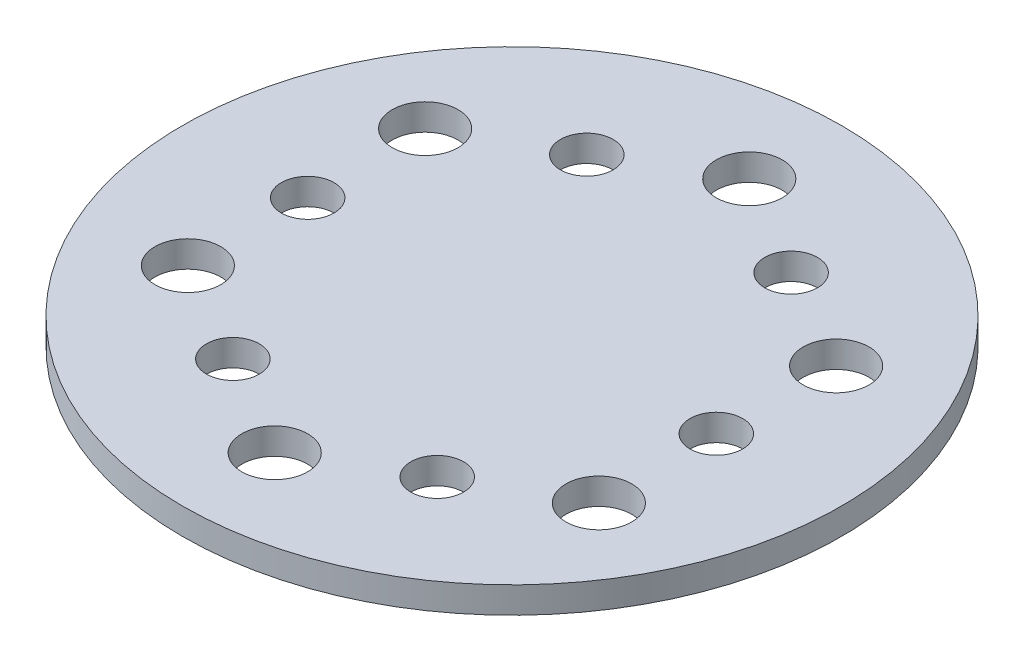
ISO-10303-21;
HEADER;
FILE_DESCRIPTION(('STEP AP214'),'2;1');
FILE_NAME('part.step','',(''),(''),'','','');
FILE_SCHEMA(('AUTOMOTIVE_DESIGN { 1 0 10303 214 1 1 1 1 }'));
ENDSEC;
DATA;
#1=APPLICATION_CONTEXT('core data for automotive mechanical design processes');
#2=APPLICATION_PROTOCOL_DEFINITION('international standard','automotive_design',2000,#1);
#3=PRODUCT_CONTEXT('',#1,'mechanical');
#4=PRODUCT('Part','Part','',(#3));
#5=PRODUCT_RELATED_PRODUCT_CATEGORY('part','',(#4));
#6=PRODUCT_DEFINITION_FORMATION('','',#4);
#7=PRODUCT_DEFINITION_CONTEXT('part definition',#1,'design');
#8=PRODUCT_DEFINITION('design','',#6,#7);
#9=PRODUCT_DEFINITION_SHAPE('','',#8);
#10=(LENGTH_UNIT() NAMED_UNIT(*) SI_UNIT(.MILLI.,.METRE.));
#11=(NAMED_UNIT(*) PLANE_ANGLE_UNIT() SI_UNIT($,.RADIAN.));
#12=(NAMED_UNIT(*) SI_UNIT($,.STERADIAN.) SOLID_ANGLE_UNIT());
#13=UNCERTAINTY_MEASURE_WITH_UNIT(LENGTH_MEASURE(1.E-05),#10,'distance_accuracy_value','');
#14=(GEOMETRIC_REPRESENTATION_CONTEXT(3) GLOBAL_UNCERTAINTY_ASSIGNED_CONTEXT((#13)) GLOBAL_UNIT_ASSIGNED_CONTEXT((#10,
#11,#12)) REPRESENTATION_CONTEXT('',''));
#15=CARTESIAN_POINT('',(0.,0.,0.));
#16=DIRECTION('',(0.,0.,1.));
#17=DIRECTION('',(1.,0.,0.));
#18=AXIS2_PLACEMENT_3D('',#15,#16,#17);
#19=CARTESIAN_POINT('',(0.,2.,0.));
#20=DIRECTION('',(0.,-1.,0.));
#21=DIRECTION('',(0.,0.,-1.));
#22=AXIS2_PLACEMENT_3D('',#19,#20,#21);
#23=CYLINDRICAL_SURFACE('',#22,25.);
#24=CARTESIAN_POINT('',(0.,2.,0.));
#25=DIRECTION('',(0.,1.,0.));
#26=DIRECTION('',(0.,0.,1.));
#27=AXIS2_PLACEMENT_3D('',#24,#25,#26);
#28=CIRCLE('',#27,25.);
#29=CARTESIAN_POINT('',(0.,2.,25.));
#30=VERTEX_POINT('',#29);
#31=EDGE_CURVE('E10',#30,#30,#28,.T.);
#32=ORIENTED_EDGE('',*,*,#31,.F.);
#33=EDGE_LOOP('',(#32));
#34=FACE_BOUND('',#33,.T.);
#35=CARTESIAN_POINT('',(0.,0.,0.));
#36=DIRECTION('',(0.,1.,0.));
#37=DIRECTION('',(0.,0.,1.));
#38=AXIS2_PLACEMENT_3D('',#35,#36,#37);
#39=CIRCLE('',#38,25.);
#40=CARTESIAN_POINT('',(0.,0.,25.));
#41=VERTEX_POINT('',#40);
#42=EDGE_CURVE('E40',#41,#41,#39,.T.);
#43=ORIENTED_EDGE('',*,*,#42,.T.);
#44=EDGE_LOOP('',(#43));
#45=FACE_BOUND('',#44,.T.);
#46=ADVANCED_FACE('F37',(#34,#45),#23,.T.);
#47=CARTESIAN_POINT('',(0.,2.,0.));
#48=DIRECTION('',(0.,1.,0.));
#49=DIRECTION('',(0.,0.,1.));
#50=AXIS2_PLACEMENT_3D('',#47,#48,#49);
#51=PLANE('',#50);
#52=CARTESIAN_POINT('',(-1.25693328198353E-13,2.,18.));
#53=DIRECTION('',(0.,1.,0.));
#54=DIRECTION('',(0.,0.,1.));
#55=AXIS2_PLACEMENT_3D('',#52,#53,#54);
#56=CIRCLE('',#55,2.5);
#57=CARTESIAN_POINT('',(-1.25693328198353E-13,2.,20.5));
#58=VERTEX_POINT('',#57);
#59=EDGE_CURVE('E64',#58,#58,#56,.T.);
#60=ORIENTED_EDGE('',*,*,#59,.F.);
#61=EDGE_LOOP('',(#60));
#62=FACE_BOUND('',#61,.T.);
#63=CARTESIAN_POINT('',(-7.74999999999997,2.,-13.4233937586588));
#64=DIRECTION('',(0.,1.,0.));
#65=DIRECTION('',(0.,0.,1.));
#66=AXIS2_PLACEMENT_3D('',#63,#64,#65);
#67=CIRCLE('',#66,2.);
#68=CARTESIAN_POINT('',(-7.74999999999997,2.,-11.4233937586588));
#69=VERTEX_POINT('',#68);
#70=EDGE_CURVE('E95',#69,#69,#67,.T.);
#71=ORIENTED_EDGE('',*,*,#70,.F.);
#72=EDGE_LOOP('',(#71));
#73=FACE_BOUND('',#72,.T.);
#74=CARTESIAN_POINT('',(-15.5884572681198,2.,-9.00000000000018));
#75=DIRECTION('',(0.,1.,0.));
#76=DIRECTION('',(0.,0.,1.));
#77=AXIS2_PLACEMENT_3D('',#74,#75,#76);
#78=CIRCLE('',#77,2.5);
#79=CARTESIAN_POINT('',(-15.5884572681198,2.,-6.50000000000018));
#80=VERTEX_POINT('',#79);
#81=EDGE_CURVE('E96',#80,#80,#78,.T.);
#82=ORIENTED_EDGE('',*,*,#81,.F.);
#83=EDGE_LOOP('',(#82));
#84=FACE_BOUND('',#83,.T.);
#85=CARTESIAN_POINT('',(-7.75000000000016,2.,13.4233937586587));
#86=DIRECTION('',(0.,1.,0.));
#87=DIRECTION('',(0.,0.,1.));
#88=AXIS2_PLACEMENT_3D('',#85,#86,#87);
#89=CIRCLE('',#88,2.);
#90=CARTESIAN_POINT('',(-7.75000000000016,2.,15.4233937586587));
#91=VERTEX_POINT('',#90);
#92=EDGE_CURVE('E111',#91,#91,#89,.T.);
#93=ORIENTED_EDGE('',*,*,#92,.F.);
#94=EDGE_LOOP('',(#93));
#95=FACE_BOUND('',#94,.T.);
#96=CARTESIAN_POINT('',(-15.5884572681199,2.,9.00000000000001));
#97=DIRECTION('',(0.,1.,0.));
#98=DIRECTION('',(0.,0.,1.));
#99=AXIS2_PLACEMENT_3D('',#96,#97,#98);
#100=CIRCLE('',#99,2.50000000000017);
#101=CARTESIAN_POINT('',(-15.5884572681199,2.,11.5000000000002));
#102=VERTEX_POINT('',#101);
#103=EDGE_CURVE('E63',#102,#102,#100,.T.);
#104=ORIENTED_EDGE('',*,*,#103,.F.);
#105=EDGE_LOOP('',(#104));
#106=FACE_BOUND('',#105,.T.);
#107=CARTESIAN_POINT('',(0.,2.,-18.));
#108=DIRECTION('',(0.,1.,0.));
#109=DIRECTION('',(0.,0.,1.));
#110=AXIS2_PLACEMENT_3D('',#107,#108,#109);
#111=CIRCLE('',#110,2.5);
#112=CARTESIAN_POINT('',(0.,2.,-15.5));
#113=VERTEX_POINT('',#112);
#114=EDGE_CURVE('E72',#113,#113,#111,.T.);
#115=ORIENTED_EDGE('',*,*,#114,.F.);
#116=EDGE_LOOP('',(#115));
#117=FACE_BOUND('',#116,.T.);
#118=CARTESIAN_POINT('',(15.5884572681199,2.,-8.99999999999996));
#119=DIRECTION('',(0.,1.,0.));
#120=DIRECTION('',(0.,0.,1.));
#121=AXIS2_PLACEMENT_3D('',#118,#119,#120);
#122=CIRCLE('',#121,2.5);
#123=CARTESIAN_POINT('',(15.5884572681199,2.,-6.49999999999996));
#124=VERTEX_POINT('',#123);
#125=EDGE_CURVE('E80',#124,#124,#122,.T.);
#126=ORIENTED_EDGE('',*,*,#125,.F.);
#127=EDGE_LOOP('',(#126));
#128=FACE_BOUND('',#127,.T.);
#129=CARTESIAN_POINT('',(15.5884572681199,2.,9.00000000000007));
#130=DIRECTION('',(0.,1.,0.));
#131=DIRECTION('',(0.,0.,1.));
#132=AXIS2_PLACEMENT_3D('',#129,#130,#131);
#133=CIRCLE('',#132,2.5);
#134=CARTESIAN_POINT('',(15.5884572681199,2.,11.5000000000001));
#135=VERTEX_POINT('',#134);
#136=EDGE_CURVE('E55',#135,#135,#133,.T.);
#137=ORIENTED_EDGE('',*,*,#136,.F.);
#138=EDGE_LOOP('',(#137));
#139=FACE_BOUND('',#138,.T.);
#140=CARTESIAN_POINT('',(7.74999999999987,2.,13.4233937586589));
#141=DIRECTION('',(0.,1.,0.));
#142=DIRECTION('',(0.,0.,1.));
#143=AXIS2_PLACEMENT_3D('',#140,#141,#142);
#144=CIRCLE('',#143,2.);
#145=CARTESIAN_POINT('',(7.74999999999987,2.,15.4233937586589));
#146=VERTEX_POINT('',#145);
#147=EDGE_CURVE('E112',#146,#146,#144,.T.);
#148=ORIENTED_EDGE('',*,*,#147,.F.);
#149=EDGE_LOOP('',(#148));
#150=FACE_BOUND('',#149,.T.);
#151=CARTESIAN_POINT('',(15.5,2.,1.08235921504137E-13));
#152=DIRECTION('',(0.,1.,0.));
#153=DIRECTION('',(0.,0.,1.));
#154=AXIS2_PLACEMENT_3D('',#151,#152,#153);
#155=CIRCLE('',#154,2.);
#156=CARTESIAN_POINT('',(15.5,2.,2.00000000000011));
#157=VERTEX_POINT('',#156);
#158=EDGE_CURVE('E135',#157,#157,#155,.T.);
#159=ORIENTED_EDGE('',*,*,#158,.F.);
#160=EDGE_LOOP('',(#159));
#161=FACE_BOUND('',#160,.T.);
#162=CARTESIAN_POINT('',(7.75000000000006,2.,-13.4233937586588));
#163=DIRECTION('',(0.,1.,0.));
#164=DIRECTION('',(0.,0.,1.));
#165=AXIS2_PLACEMENT_3D('',#162,#163,#164);
#166=CIRCLE('',#165,2.);
#167=CARTESIAN_POINT('',(7.75000000000006,2.,-11.4233937586588));
#168=VERTEX_POINT('',#167);
#169=EDGE_CURVE('E127',#168,#168,#166,.T.);
#170=ORIENTED_EDGE('',*,*,#169,.F.);
#171=EDGE_LOOP('',(#170));
#172=FACE_BOUND('',#171,.T.);
#173=CARTESIAN_POINT('',(-15.5,2.,0.));
#174=DIRECTION('',(0.,1.,0.));
#175=DIRECTION('',(0.,0.,1.));
#176=AXIS2_PLACEMENT_3D('',#173,#174,#175);
#177=CIRCLE('',#176,2.);
#178=CARTESIAN_POINT('',(-15.5,2.,2.));
#179=VERTEX_POINT('',#178);
#180=EDGE_CURVE('E51',#179,#179,#177,.T.);
#181=ORIENTED_EDGE('',*,*,#180,.F.);
#182=EDGE_LOOP('',(#181));
#183=FACE_BOUND('',#182,.T.);
#184=ORIENTED_EDGE('',*,*,#31,.T.);
#185=EDGE_LOOP('',(#184));
#186=FACE_BOUND('',#185,.T.);
#187=ADVANCED_FACE('F149',(#62,#73,#84,#95,#106,#117,#128,#139,#150,#161,#172,#183,#186),#51,.T.);
#188=CARTESIAN_POINT('',(0.,0.,0.));
#189=DIRECTION('',(0.,1.,0.));
#190=DIRECTION('',(0.,0.,1.));
#191=AXIS2_PLACEMENT_3D('',#188,#189,#190);
#192=PLANE('',#191);
#193=CARTESIAN_POINT('',(-1.25693328198353E-13,0.,18.));
#194=DIRECTION('',(0.,1.,0.));
#195=DIRECTION('',(0.,0.,1.));
#196=AXIS2_PLACEMENT_3D('',#193,#194,#195);
#197=CIRCLE('',#196,2.5);
#198=CARTESIAN_POINT('',(-1.25693328198353E-13,0.,20.5));
#199=VERTEX_POINT('',#198);
#200=EDGE_CURVE('E100',#199,#199,#197,.T.);
#201=ORIENTED_EDGE('',*,*,#200,.T.);
#202=EDGE_LOOP('',(#201));
#203=FACE_BOUND('',#202,.T.);
#204=CARTESIAN_POINT('',(-7.74999999999997,0.,-13.4233937586588));
#205=DIRECTION('',(0.,1.,0.));
#206=DIRECTION('',(0.,0.,1.));
#207=AXIS2_PLACEMENT_3D('',#204,#205,#206);
#208=CIRCLE('',#207,2.);
#209=CARTESIAN_POINT('',(-7.74999999999997,0.,-11.4233937586588));
#210=VERTEX_POINT('',#209);
#211=EDGE_CURVE('E91',#210,#210,#208,.T.);
#212=ORIENTED_EDGE('',*,*,#211,.T.);
#213=EDGE_LOOP('',(#212));
#214=FACE_BOUND('',#213,.T.);
#215=CARTESIAN_POINT('',(-15.5884572681198,0.,-9.00000000000018));
#216=DIRECTION('',(0.,1.,0.));
#217=DIRECTION('',(0.,0.,1.));
#218=AXIS2_PLACEMENT_3D('',#215,#216,#217);
#219=CIRCLE('',#218,2.5);
#220=CARTESIAN_POINT('',(-15.5884572681198,0.,-6.50000000000018));
#221=VERTEX_POINT('',#220);
#222=EDGE_CURVE('E116',#221,#221,#219,.T.);
#223=ORIENTED_EDGE('',*,*,#222,.T.);
#224=EDGE_LOOP('',(#223));
#225=FACE_BOUND('',#224,.T.);
#226=CARTESIAN_POINT('',(-7.75000000000016,0.,13.4233937586587));
#227=DIRECTION('',(0.,1.,0.));
#228=DIRECTION('',(0.,0.,1.));
#229=AXIS2_PLACEMENT_3D('',#226,#227,#228);
#230=CIRCLE('',#229,2.);
#231=CARTESIAN_POINT('',(-7.75000000000016,0.,15.4233937586587));
#232=VERTEX_POINT('',#231);
#233=EDGE_CURVE('E107',#232,#232,#230,.T.);
#234=ORIENTED_EDGE('',*,*,#233,.T.);
#235=EDGE_LOOP('',(#234));
#236=FACE_BOUND('',#235,.T.);
#237=CARTESIAN_POINT('',(-15.5884572681199,0.,9.00000000000001));
#238=DIRECTION('',(0.,1.,0.));
#239=DIRECTION('',(0.,0.,1.));
#240=AXIS2_PLACEMENT_3D('',#237,#238,#239);
#241=CIRCLE('',#240,2.50000000000017);
#242=CARTESIAN_POINT('',(-15.5884572681199,0.,11.5000000000002));
#243=VERTEX_POINT('',#242);
#244=EDGE_CURVE('E59',#243,#243,#241,.T.);
#245=ORIENTED_EDGE('',*,*,#244,.T.);
#246=EDGE_LOOP('',(#245));
#247=FACE_BOUND('',#246,.T.);
#248=CARTESIAN_POINT('',(0.,0.,-18.));
#249=DIRECTION('',(0.,1.,0.));
#250=DIRECTION('',(0.,0.,1.));
#251=AXIS2_PLACEMENT_3D('',#248,#249,#250);
#252=CIRCLE('',#251,2.5);
#253=CARTESIAN_POINT('',(0.,0.,-15.5));
#254=VERTEX_POINT('',#253);
#255=EDGE_CURVE('E68',#254,#254,#252,.T.);
#256=ORIENTED_EDGE('',*,*,#255,.T.);
#257=EDGE_LOOP('',(#256));
#258=FACE_BOUND('',#257,.T.);
#259=CARTESIAN_POINT('',(15.5884572681199,0.,-8.99999999999996));
#260=DIRECTION('',(0.,1.,0.));
#261=DIRECTION('',(0.,0.,1.));
#262=AXIS2_PLACEMENT_3D('',#259,#260,#261);
#263=CIRCLE('',#262,2.5);
#264=CARTESIAN_POINT('',(15.5884572681199,0.,-6.49999999999996));
#265=VERTEX_POINT('',#264);
#266=EDGE_CURVE('E76',#265,#265,#263,.T.);
#267=ORIENTED_EDGE('',*,*,#266,.T.);
#268=EDGE_LOOP('',(#267));
#269=FACE_BOUND('',#268,.T.);
#270=CARTESIAN_POINT('',(15.5884572681199,0.,9.00000000000007));
#271=DIRECTION('',(0.,1.,0.));
#272=DIRECTION('',(0.,0.,1.));
#273=AXIS2_PLACEMENT_3D('',#270,#271,#272);
#274=CIRCLE('',#273,2.5);
#275=CARTESIAN_POINT('',(15.5884572681199,0.,11.5000000000001));
#276=VERTEX_POINT('',#275);
#277=EDGE_CURVE('E84',#276,#276,#274,.T.);
#278=ORIENTED_EDGE('',*,*,#277,.T.);
#279=EDGE_LOOP('',(#278));
#280=FACE_BOUND('',#279,.T.);
#281=CARTESIAN_POINT('',(7.74999999999987,0.,13.4233937586589));
#282=DIRECTION('',(0.,1.,0.));
#283=DIRECTION('',(0.,0.,1.));
#284=AXIS2_PLACEMENT_3D('',#281,#282,#283);
#285=CIRCLE('',#284,2.);
#286=CARTESIAN_POINT('',(7.74999999999987,0.,15.4233937586589));
#287=VERTEX_POINT('',#286);
#288=EDGE_CURVE('E139',#287,#287,#285,.T.);
#289=ORIENTED_EDGE('',*,*,#288,.T.);
#290=EDGE_LOOP('',(#289));
#291=FACE_BOUND('',#290,.T.);
#292=CARTESIAN_POINT('',(15.5,0.,1.08235921504137E-13));
#293=DIRECTION('',(0.,1.,0.));
#294=DIRECTION('',(0.,0.,1.));
#295=AXIS2_PLACEMENT_3D('',#292,#293,#294);
#296=CIRCLE('',#295,2.);
#297=CARTESIAN_POINT('',(15.5,0.,2.00000000000011));
#298=VERTEX_POINT('',#297);
#299=EDGE_CURVE('E131',#298,#298,#296,.T.);
#300=ORIENTED_EDGE('',*,*,#299,.T.);
#301=EDGE_LOOP('',(#300));
#302=FACE_BOUND('',#301,.T.);
#303=CARTESIAN_POINT('',(7.75000000000006,0.,-13.4233937586588));
#304=DIRECTION('',(0.,1.,0.));
#305=DIRECTION('',(0.,0.,1.));
#306=AXIS2_PLACEMENT_3D('',#303,#304,#305);
#307=CIRCLE('',#306,2.);
#308=CARTESIAN_POINT('',(7.75000000000006,0.,-11.4233937586588));
#309=VERTEX_POINT('',#308);
#310=EDGE_CURVE('E123',#309,#309,#307,.T.);
#311=ORIENTED_EDGE('',*,*,#310,.T.);
#312=EDGE_LOOP('',(#311));
#313=FACE_BOUND('',#312,.T.);
#314=CARTESIAN_POINT('',(-15.5,0.,0.));
#315=DIRECTION('',(0.,1.,0.));
#316=DIRECTION('',(0.,0.,1.));
#317=AXIS2_PLACEMENT_3D('',#314,#315,#316);
#318=CIRCLE('',#317,2.);
#319=CARTESIAN_POINT('',(-15.5,0.,2.));
#320=VERTEX_POINT('',#319);
#321=EDGE_CURVE('E49',#320,#320,#318,.T.);
#322=ORIENTED_EDGE('',*,*,#321,.T.);
#323=EDGE_LOOP('',(#322));
#324=FACE_BOUND('',#323,.T.);
#325=ORIENTED_EDGE('',*,*,#42,.F.);
#326=EDGE_LOOP('',(#325));
#327=FACE_BOUND('',#326,.T.);
#328=ADVANCED_FACE('F152',(#203,#214,#225,#236,#247,#258,#269,#280,#291,#302,#313,#324,#327),
#192,.F.);
#329=CARTESIAN_POINT('',(-15.5,0.,0.));
#330=DIRECTION('',(0.,1.,0.));
#331=DIRECTION('',(0.,0.,1.));
#332=AXIS2_PLACEMENT_3D('',#329,#330,#331);
#333=CYLINDRICAL_SURFACE('',#332,2.);
#334=ORIENTED_EDGE('',*,*,#321,.F.);
#335=EDGE_LOOP('',(#334));
#336=FACE_BOUND('',#335,.T.);
#337=ORIENTED_EDGE('',*,*,#180,.T.);
#338=EDGE_LOOP('',(#337));
#339=FACE_BOUND('',#338,.T.);
#340=ADVANCED_FACE('F161',(#336,#339),#333,.F.);
#341=CARTESIAN_POINT('',(7.75000000000006,0.,-13.4233937586588));
#342=DIRECTION('',(0.,1.,0.));
#343=DIRECTION('',(0.,0.,1.));
#344=AXIS2_PLACEMENT_3D('',#341,#342,#343);
#345=CYLINDRICAL_SURFACE('',#344,2.);
#346=ORIENTED_EDGE('',*,*,#310,.F.);
#347=EDGE_LOOP('',(#346));
#348=FACE_BOUND('',#347,.T.);
#349=ORIENTED_EDGE('',*,*,#169,.T.);
#350=EDGE_LOOP('',(#349));
#351=FACE_BOUND('',#350,.T.);
#352=ADVANCED_FACE('F163',(#348,#351),#345,.F.);
#353=CARTESIAN_POINT('',(15.5,0.,1.08235921504137E-13));
#354=DIRECTION('',(0.,1.,0.));
#355=DIRECTION('',(0.,0.,1.));
#356=AXIS2_PLACEMENT_3D('',#353,#354,#355);
#357=CYLINDRICAL_SURFACE('',#356,2.);
#358=ORIENTED_EDGE('',*,*,#299,.F.);
#359=EDGE_LOOP('',(#358));
#360=FACE_BOUND('',#359,.T.);
#361=ORIENTED_EDGE('',*,*,#158,.T.);
#362=EDGE_LOOP('',(#361));
#363=FACE_BOUND('',#362,.T.);
#364=ADVANCED_FACE('F170',(#360,#363),#357,.F.);
#365=CARTESIAN_POINT('',(7.74999999999987,0.,13.4233937586589));
#366=DIRECTION('',(0.,1.,0.));
#367=DIRECTION('',(0.,0.,1.));
#368=AXIS2_PLACEMENT_3D('',#365,#366,#367);
#369=CYLINDRICAL_SURFACE('',#368,2.);
#370=ORIENTED_EDGE('',*,*,#288,.F.);
#371=EDGE_LOOP('',(#370));
#372=FACE_BOUND('',#371,.T.);
#373=ORIENTED_EDGE('',*,*,#147,.T.);
#374=EDGE_LOOP('',(#373));
#375=FACE_BOUND('',#374,.T.);
#376=ADVANCED_FACE('F147',(#372,#375),#369,.F.);
#377=CARTESIAN_POINT('',(15.5884572681199,0.,9.00000000000007));
#378=DIRECTION('',(0.,1.,0.));
#379=DIRECTION('',(0.,0.,1.));
#380=AXIS2_PLACEMENT_3D('',#377,#378,#379);
#381=CYLINDRICAL_SURFACE('',#380,2.5);
#382=ORIENTED_EDGE('',*,*,#277,.F.);
#383=EDGE_LOOP('',(#382));
#384=FACE_BOUND('',#383,.T.);
#385=ORIENTED_EDGE('',*,*,#136,.T.);
#386=EDGE_LOOP('',(#385));
#387=FACE_BOUND('',#386,.T.);
#388=ADVANCED_FACE('F221',(#384,#387),#381,.F.);
#389=CARTESIAN_POINT('',(15.5884572681199,0.,-8.99999999999996));
#390=DIRECTION('',(0.,1.,0.));
#391=DIRECTION('',(0.,0.,1.));
#392=AXIS2_PLACEMENT_3D('',#389,#390,#391);
#393=CYLINDRICAL_SURFACE('',#392,2.5);
#394=ORIENTED_EDGE('',*,*,#266,.F.);
#395=EDGE_LOOP('',(#394));
#396=FACE_BOUND('',#395,.T.);
#397=ORIENTED_EDGE('',*,*,#125,.T.);
#398=EDGE_LOOP('',(#397));
#399=FACE_BOUND('',#398,.T.);
#400=ADVANCED_FACE('F231',(#396,#399),#393,.F.);
#401=CARTESIAN_POINT('',(0.,0.,-18.));
#402=DIRECTION('',(0.,1.,0.));
#403=DIRECTION('',(0.,0.,1.));
#404=AXIS2_PLACEMENT_3D('',#401,#402,#403);
#405=CYLINDRICAL_SURFACE('',#404,2.5);
#406=ORIENTED_EDGE('',*,*,#255,.F.);
#407=EDGE_LOOP('',(#406));
#408=FACE_BOUND('',#407,.T.);
#409=ORIENTED_EDGE('',*,*,#114,.T.);
#410=EDGE_LOOP('',(#409));
#411=FACE_BOUND('',#410,.T.);
#412=ADVANCED_FACE('F241',(#408,#411),#405,.F.);
#413=CARTESIAN_POINT('',(-15.5884572681199,0.,9.00000000000001));
#414=DIRECTION('',(0.,1.,0.));
#415=DIRECTION('',(0.,0.,1.));
#416=AXIS2_PLACEMENT_3D('',#413,#414,#415);
#417=CYLINDRICAL_SURFACE('',#416,2.50000000000017);
#418=ORIENTED_EDGE('',*,*,#244,.F.);
#419=EDGE_LOOP('',(#418));
#420=FACE_BOUND('',#419,.T.);
#421=ORIENTED_EDGE('',*,*,#103,.T.);
#422=EDGE_LOOP('',(#421));
#423=FACE_BOUND('',#422,.T.);
#424=ADVANCED_FACE('F251',(#420,#423),#417,.F.);
#425=CARTESIAN_POINT('',(-7.75000000000016,0.,13.4233937586587));
#426=DIRECTION('',(0.,1.,0.));
#427=DIRECTION('',(0.,0.,1.));
#428=AXIS2_PLACEMENT_3D('',#425,#426,#427);
#429=CYLINDRICAL_SURFACE('',#428,2.);
#430=ORIENTED_EDGE('',*,*,#233,.F.);
#431=EDGE_LOOP('',(#430));
#432=FACE_BOUND('',#431,.T.);
#433=ORIENTED_EDGE('',*,*,#92,.T.);
#434=EDGE_LOOP('',(#433));
#435=FACE_BOUND('',#434,.T.);
#436=ADVANCED_FACE('F261',(#432,#435),#429,.F.);
#437=CARTESIAN_POINT('',(-15.5884572681198,0.,-9.00000000000018));
#438=DIRECTION('',(0.,1.,0.));
#439=DIRECTION('',(0.,0.,1.));
#440=AXIS2_PLACEMENT_3D('',#437,#438,#439);
#441=CYLINDRICAL_SURFACE('',#440,2.5);
#442=ORIENTED_EDGE('',*,*,#222,.F.);
#443=EDGE_LOOP('',(#442));
#444=FACE_BOUND('',#443,.T.);
#445=ORIENTED_EDGE('',*,*,#81,.T.);
#446=EDGE_LOOP('',(#445));
#447=FACE_BOUND('',#446,.T.);
#448=ADVANCED_FACE('F270',(#444,#447),#441,.F.);
#449=CARTESIAN_POINT('',(-7.74999999999997,0.,-13.4233937586588));
#450=DIRECTION('',(0.,1.,0.));
#451=DIRECTION('',(0.,0.,1.));
#452=AXIS2_PLACEMENT_3D('',#449,#450,#451);
#453=CYLINDRICAL_SURFACE('',#452,2.);
#454=ORIENTED_EDGE('',*,*,#211,.F.);
#455=EDGE_LOOP('',(#454));
#456=FACE_BOUND('',#455,.T.);
#457=ORIENTED_EDGE('',*,*,#70,.T.);
#458=EDGE_LOOP('',(#457));
#459=FACE_BOUND('',#458,.T.);
#460=ADVANCED_FACE('F280',(#456,#459),#453,.F.);
#461=CARTESIAN_POINT('',(-1.25693328198353E-13,0.,18.));
#462=DIRECTION('',(0.,1.,0.));
#463=DIRECTION('',(0.,0.,1.));
#464=AXIS2_PLACEMENT_3D('',#461,#462,#463);
#465=CYLINDRICAL_SURFACE('',#464,2.5);
#466=ORIENTED_EDGE('',*,*,#200,.F.);
#467=EDGE_LOOP('',(#466));
#468=FACE_BOUND('',#467,.T.);
#469=ORIENTED_EDGE('',*,*,#59,.T.);
#470=EDGE_LOOP('',(#469));
#471=FACE_BOUND('',#470,.T.);
#472=ADVANCED_FACE('F290',(#468,#471),#465,.F.);
#473=CLOSED_SHELL('',(#46,#187,#328,#340,#352,#364,#376,#388,#400,#412,#424,#436,#448,#460,#472));
#474=MANIFOLD_SOLID_BREP('B2',#473);
#475=ADVANCED_BREP_SHAPE_REPRESENTATION('',(#18,#474),#14);
#476=SHAPE_DEFINITION_REPRESENTATION(#9,#475);
ENDSEC;
END-ISO-10303-21;
